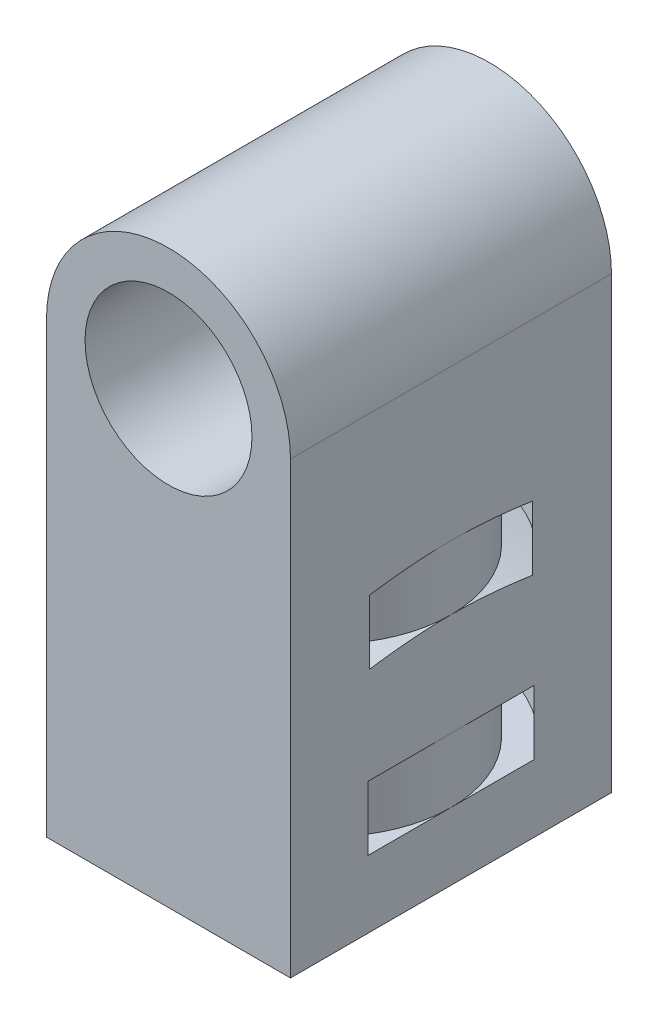
ISO-10303-21;
HEADER;
FILE_DESCRIPTION(('STEP AP214'),'2;1');
FILE_NAME('part.step','',(''),(''),'','','');
FILE_SCHEMA(('AUTOMOTIVE_DESIGN { 1 0 10303 214 1 1 1 1 }'));
ENDSEC;
DATA;
#1=APPLICATION_CONTEXT('core data for automotive mechanical design processes');
#2=APPLICATION_PROTOCOL_DEFINITION('international standard','automotive_design',2000,#1);
#3=PRODUCT_CONTEXT('',#1,'mechanical');
#4=PRODUCT('Part','Part','',(#3));
#5=PRODUCT_RELATED_PRODUCT_CATEGORY('part','',(#4));
#6=PRODUCT_DEFINITION_FORMATION('','',#4);
#7=PRODUCT_DEFINITION_CONTEXT('part definition',#1,'design');
#8=PRODUCT_DEFINITION('design','',#6,#7);
#9=PRODUCT_DEFINITION_SHAPE('','',#8);
#10=(LENGTH_UNIT() NAMED_UNIT(*) SI_UNIT(.MILLI.,.METRE.));
#11=(NAMED_UNIT(*) PLANE_ANGLE_UNIT() SI_UNIT($,.RADIAN.));
#12=(NAMED_UNIT(*) SI_UNIT($,.STERADIAN.) SOLID_ANGLE_UNIT());
#13=UNCERTAINTY_MEASURE_WITH_UNIT(LENGTH_MEASURE(1.E-05),#10,'distance_accuracy_value','');
#14=(GEOMETRIC_REPRESENTATION_CONTEXT(3) GLOBAL_UNCERTAINTY_ASSIGNED_CONTEXT((#13)) GLOBAL_UNIT_ASSIGNED_CONTEXT((#10,
#11,#12)) REPRESENTATION_CONTEXT('',''));
#15=CARTESIAN_POINT('',(0.,0.,0.));
#16=DIRECTION('',(0.,0.,1.));
#17=DIRECTION('',(1.,0.,0.));
#18=AXIS2_PLACEMENT_3D('',#15,#16,#17);
#19=CARTESIAN_POINT('',(9.5,-10.,-12.5));
#20=DIRECTION('',(1.,0.,0.));
#21=DIRECTION('',(0.,1.,0.));
#22=AXIS2_PLACEMENT_3D('',#19,#20,#21);
#23=PLANE('',#22);
#24=DIRECTION('',(0.,0.,-1.));
#25=VECTOR('',#24,1.);
#26=CARTESIAN_POINT('',(9.5,-29.75,-12.5));
#27=LINE('',#26,#25);
#28=CARTESIAN_POINT('',(9.5,-29.75,6.48074069840786));
#29=VERTEX_POINT('',#28);
#30=CARTESIAN_POINT('',(9.5,-29.75,0.));
#31=VERTEX_POINT('',#30);
#32=EDGE_CURVE('E299',#29,#31,#27,.T.);
#33=ORIENTED_EDGE('',*,*,#32,.F.);
#34=DIRECTION('',(0.,1.,0.));
#35=VECTOR('',#34,1.);
#36=CARTESIAN_POINT('',(9.5,-6.5,6.48074069840786));
#37=LINE('',#36,#35);
#38=CARTESIAN_POINT('',(9.5,-24.75,6.48074069840786));
#39=VERTEX_POINT('',#38);
#40=EDGE_CURVE('E339',#39,#29,#37,.F.);
#41=ORIENTED_EDGE('',*,*,#40,.F.);
#42=DIRECTION('',(0.,0.,-1.));
#43=VECTOR('',#42,1.);
#44=CARTESIAN_POINT('',(9.5,-24.75,-12.5));
#45=LINE('',#44,#43);
#46=CARTESIAN_POINT('',(9.5,-24.75,0.));
#47=VERTEX_POINT('',#46);
#48=EDGE_CURVE('E338',#39,#47,#45,.T.);
#49=ORIENTED_EDGE('',*,*,#48,.T.);
#50=CARTESIAN_POINT('',(9.5,-24.75,-6.48074069840786));
#51=VERTEX_POINT('',#50);
#52=EDGE_CURVE('E173',#47,#51,#45,.T.);
#53=ORIENTED_EDGE('',*,*,#52,.T.);
#54=DIRECTION('',(0.,1.,0.));
#55=VECTOR('',#54,1.);
#56=CARTESIAN_POINT('',(9.5,-6.5,-6.48074069840786));
#57=LINE('',#56,#55);
#58=CARTESIAN_POINT('',(9.5,-29.75,-6.48074069840786));
#59=VERTEX_POINT('',#58);
#60=EDGE_CURVE('E341',#59,#51,#57,.T.);
#61=ORIENTED_EDGE('',*,*,#60,.F.);
#62=EDGE_CURVE('E343',#31,#59,#27,.T.);
#63=ORIENTED_EDGE('',*,*,#62,.F.);
#64=EDGE_LOOP('',(#33,#41,#49,#53,#61,#63));
#65=FACE_BOUND('',#64,.T.);
#66=DIRECTION('',(0.,1.,0.));
#67=VECTOR('',#66,1.);
#68=CARTESIAN_POINT('',(9.5,-10.,12.5));
#69=LINE('',#68,#67);
#70=CARTESIAN_POINT('',(9.5,-35.,12.5));
#71=VERTEX_POINT('',#70);
#72=CARTESIAN_POINT('',(9.5,0.,12.5));
#73=VERTEX_POINT('',#72);
#74=EDGE_CURVE('E303',#71,#73,#69,.T.);
#75=ORIENTED_EDGE('',*,*,#74,.F.);
#76=DIRECTION('',(0.,0.,1.));
#77=VECTOR('',#76,1.);
#78=CARTESIAN_POINT('',(9.5,-35.,-12.5));
#79=LINE('',#78,#77);
#80=CARTESIAN_POINT('',(9.5,-35.,-12.5));
#81=VERTEX_POINT('',#80);
#82=EDGE_CURVE('E563',#81,#71,#79,.T.);
#83=ORIENTED_EDGE('',*,*,#82,.F.);
#84=DIRECTION('',(0.,1.,0.));
#85=VECTOR('',#84,1.);
#86=CARTESIAN_POINT('',(9.5,-10.,-12.5));
#87=LINE('',#86,#85);
#88=CARTESIAN_POINT('',(9.5,0.,-12.5));
#89=VERTEX_POINT('',#88);
#90=EDGE_CURVE('E552',#81,#89,#87,.T.);
#91=ORIENTED_EDGE('',*,*,#90,.T.);
#92=DIRECTION('',(0.,0.,1.));
#93=VECTOR('',#92,1.);
#94=CARTESIAN_POINT('',(9.5,0.,-12.5));
#95=LINE('',#94,#93);
#96=EDGE_CURVE('E532',#89,#73,#95,.T.);
#97=ORIENTED_EDGE('',*,*,#96,.T.);
#98=EDGE_LOOP('',(#75,#83,#91,#97));
#99=FACE_BOUND('',#98,.T.);
#100=CARTESIAN_POINT('',(9.5,-18.5940001794606,34.3096150478611));
#101=CARTESIAN_POINT('',(9.5,-18.4104595878438,33.583287858128));
#102=CARTESIAN_POINT('',(9.5,-18.2272942427413,32.8568655741935));
#103=CARTESIAN_POINT('',(9.5,-17.8619040372227,31.4037835481128));
#104=CARTESIAN_POINT('',(9.5,-17.6796791780349,30.6771238056579));
#105=CARTESIAN_POINT('',(9.5,-17.316309413949,29.2233174338884));
#106=CARTESIAN_POINT('',(9.5,-17.1351648266208,28.4961707251553));
#107=CARTESIAN_POINT('',(9.5,-16.7742688751346,27.0415315671237));
#108=CARTESIAN_POINT('',(9.5,-16.5945175107908,26.3140391178712));
#109=CARTESIAN_POINT('',(9.5,-16.2325036702304,24.8413595475527));
#110=CARTESIAN_POINT('',(9.5,-16.0502828229413,24.0961621847589));
#111=CARTESIAN_POINT('',(9.5,-15.6881513560162,22.6052065111694));
#112=CARTESIAN_POINT('',(9.5,-15.5082407340685,21.8594482009359));
#113=CARTESIAN_POINT('',(9.5,-15.1514551431804,20.3674081549243));
#114=CARTESIAN_POINT('',(9.5,-14.9745794026589,19.6211266039413));
#115=CARTESIAN_POINT('',(9.5,-14.6247702626984,18.1276365749566));
#116=CARTESIAN_POINT('',(9.5,-14.4518368707429,17.3804280951981));
#117=CARTESIAN_POINT('',(9.5,-14.1187198970002,15.9174306703127));
#118=CARTESIAN_POINT('',(9.5,-13.9583092568577,15.2016936038036));
#119=CARTESIAN_POINT('',(9.5,-13.6441128718866,13.7687633704708));
#120=CARTESIAN_POINT('',(9.5,-13.4903271161288,13.0515702060512));
#121=CARTESIAN_POINT('',(9.5,-13.1917895153087,11.6145241203518));
#122=CARTESIAN_POINT('',(9.5,-13.0470470186099,10.8946692356507));
#123=CARTESIAN_POINT('',(9.5,-12.839755242133,9.81298195188404));
#124=CARTESIAN_POINT('',(9.5,-12.7722931956616,9.45209172028482));
#125=CARTESIAN_POINT('',(9.5,-12.6413092515822,8.72959877826552));
#126=CARTESIAN_POINT('',(9.5,-12.5777873110619,8.36799607564936));
#127=CARTESIAN_POINT('',(9.5,-12.4562624738004,7.64881234547324));
#128=CARTESIAN_POINT('',(9.5,-12.3981973188229,7.29124192731229));
#129=CARTESIAN_POINT('',(9.5,-12.2875208224032,6.57526148055471));
#130=CARTESIAN_POINT('',(9.5,-12.2349095407431,6.2168514427987));
#131=CARTESIAN_POINT('',(9.5,-12.0867396466977,5.14026211042967));
#132=CARTESIAN_POINT('',(9.5,-12.0008366490465,4.42067580269187));
#133=CARTESIAN_POINT('',(9.5,-11.8979840507362,3.33969834915197));
#134=CARTESIAN_POINT('',(9.5,-11.8680533098223,2.97952705245293));
#135=CARTESIAN_POINT('',(9.5,-11.8178069673897,2.25850381276945));
#136=CARTESIAN_POINT('',(9.5,-11.7974912985723,1.89765187456677));
#137=CARTESIAN_POINT('',(9.5,-11.7672603900713,1.17556904098546));
#138=CARTESIAN_POINT('',(9.5,-11.7573434008062,0.814338219595086));
#139=CARTESIAN_POINT('',(9.5,-11.7483184953059,0.0917406115624856));
#140=CARTESIAN_POINT('',(9.5,-11.7492105291058,-0.269626174443523));
#141=CARTESIAN_POINT('',(9.5,-11.7615452144799,-0.979590021655254));
#142=CARTESIAN_POINT('',(9.5,-11.7726194406145,-1.32819362528374));
#143=CARTESIAN_POINT('',(9.5,-11.8043716631822,-2.02495921088784));
#144=CARTESIAN_POINT('',(9.5,-11.8250496920841,-2.3731211913664));
#145=CARTESIAN_POINT('',(9.5,-11.8752800186238,-3.06885676445908));
#146=CARTESIAN_POINT('',(9.5,-11.9048338111138,-3.41643024803479));
#147=CARTESIAN_POINT('',(9.5,-11.9718973690187,-4.11081466006508));
#148=CARTESIAN_POINT('',(9.5,-12.0094074842543,-4.45762555431275));
#149=CARTESIAN_POINT('',(9.5,-12.1325595533156,-5.49846097059398));
#150=CARTESIAN_POINT('',(9.5,-12.2286955308348,-6.19124608496361));
#151=CARTESIAN_POINT('',(9.5,-12.4413393013675,-7.57355613875835));
#152=CARTESIAN_POINT('',(9.5,-12.557846278919,-8.26308120755049));
#153=CARTESIAN_POINT('',(9.5,-12.8070220094514,-9.64873950406036));
#154=CARTESIAN_POINT('',(9.5,-12.9398867973797,-10.344837116822));
#155=CARTESIAN_POINT('',(9.5,-13.2161792537895,-11.7349056381745));
#156=CARTESIAN_POINT('',(9.5,-13.3596068317596,-12.4288765649356));
#157=CARTESIAN_POINT('',(9.5,-13.6538996084103,-13.814436250205));
#158=CARTESIAN_POINT('',(9.5,-13.8047564832014,-14.5060267859574));
#159=CARTESIAN_POINT('',(9.5,-14.1120291641412,-15.8879648182586));
#160=CARTESIAN_POINT('',(9.5,-14.2684449535411,-16.5783123185461));
#161=CARTESIAN_POINT('',(9.5,-14.5923627636727,-17.9882129158208));
#162=CARTESIAN_POINT('',(9.5,-14.760050488671,-18.7077232451551));
#163=CARTESIAN_POINT('',(9.5,-15.0988377625137,-20.1459384828576));
#164=CARTESIAN_POINT('',(9.5,-15.2699373109351,-20.8646433913256));
#165=CARTESIAN_POINT('',(9.5,-15.6148158829257,-22.3016540726439));
#166=CARTESIAN_POINT('',(9.5,-15.7885957519021,-23.0199596423348));
#167=CARTESIAN_POINT('',(9.5,-16.1382105351397,-24.4560706148763));
#168=CARTESIAN_POINT('',(9.5,-16.3140454510682,-25.1738760173206));
#169=CARTESIAN_POINT('',(9.5,-16.6635670998738,-26.5937178124066));
#170=CARTESIAN_POINT('',(9.5,-16.8372192064394,-27.295762735252));
#171=CARTESIAN_POINT('',(9.5,-17.1857929643631,-28.6995373694732));
#172=CARTESIAN_POINT('',(9.5,-17.3607146160361,-29.4012670807707));
#173=CARTESIAN_POINT('',(9.5,-17.7115372088056,-30.8042243982583));
#174=CARTESIAN_POINT('',(9.5,-17.8874377913662,-31.5054520941489));
#175=CARTESIAN_POINT('',(9.5,-18.2401088008124,-32.9076878120199));
#176=CARTESIAN_POINT('',(9.5,-18.4168792266013,-33.608695834276));
#177=CARTESIAN_POINT('',(9.5,-18.5940001794606,-34.3096150478611));
#178=B_SPLINE_CURVE_WITH_KNOTS('',3,(#100,#101,#102,#103,#104,#105,#106,#107,#108,#109,#110,
#111,#112,#113,#114,#115,#116,#117,#118,#119,#120,#121,#122,#123,#124,#125,#126,#127,#128,#129,
#130,#131,#132,#133,#134,#135,#136,#137,#138,#139,#140,#141,#142,#143,#144,#145,#146,#147,#148,
#149,#150,#151,#152,#153,#154,#155,#156,#157,#158,#159,#160,#161,#162,#163,#164,#165,#166,#167,
#168,#169,#170,#171,#172,#173,#174,#175,#176,#177),.UNSPECIFIED.,.F.,.F.,(4,2,2,2,2,2,2,2,2,2,2,
2,2,2,2,2,2,2,2,2,2,2,2,2,2,2,2,2,2,2,2,2,2,2,2,2,2,2,4),(0.,2.24747554583677,4.4949540263018,
6.74306350480392,8.99117268337091,11.2926284845608,13.5940819827856,15.894941425808,
18.1958052360467,20.3962589262327,22.5967089861222,24.7993973315644,25.9008042763521,
27.0021992234385,28.0889193333589,29.1756513540005,31.3489699082154,32.4331041183486,
33.5172307401912,34.6011749280527,35.6851141053588,36.7313134417835,37.7775163152511,
38.8238954886518,39.8703206784272,41.9681082944804,44.065811954192,46.1916871419316,
48.3175441154162,50.4410711579981,52.564591803064,54.7809581966685,56.9973243155716,
59.2144044120004,61.4314863073811,63.6010929495919,65.7707001301629,67.9395590701614,
70.1084152760672),.UNSPECIFIED.);
#179=CARTESIAN_POINT('',(9.5,-12.2572833711301,6.36396078731212));
#180=VERTEX_POINT('',#179);
#181=CARTESIAN_POINT('',(9.5,-11.75,0.));
#182=VERTEX_POINT('',#181);
#183=EDGE_CURVE('E229',#180,#182,#178,.T.);
#184=ORIENTED_EDGE('',*,*,#183,.T.);
#185=CARTESIAN_POINT('',(9.5,-12.2572833711301,-6.36396078731212));
#186=VERTEX_POINT('',#185);
#187=EDGE_CURVE('E221',#182,#186,#178,.T.);
#188=ORIENTED_EDGE('',*,*,#187,.T.);
#189=DIRECTION('',(0.,1.,0.));
#190=VECTOR('',#189,1.);
#191=CARTESIAN_POINT('',(9.5,-6.5,-6.36396078731212));
#192=LINE('',#191,#190);
#193=CARTESIAN_POINT('',(9.5,-17.2572833711301,-6.36396078731212));
#194=VERTEX_POINT('',#193);
#195=EDGE_CURVE('E230',#186,#194,#192,.F.);
#196=ORIENTED_EDGE('',*,*,#195,.T.);
#197=CARTESIAN_POINT('',(9.5,-23.5940001794606,34.3096150478611));
#198=CARTESIAN_POINT('',(9.5,-23.4104595878438,33.583287858128));
#199=CARTESIAN_POINT('',(9.5,-23.2272942427413,32.8568655741935));
#200=CARTESIAN_POINT('',(9.5,-22.8619040372227,31.4037835481128));
#201=CARTESIAN_POINT('',(9.5,-22.6796791780349,30.6771238056579));
#202=CARTESIAN_POINT('',(9.5,-22.316309413949,29.2233174338884));
#203=CARTESIAN_POINT('',(9.5,-22.1351648266208,28.4961707251553));
#204=CARTESIAN_POINT('',(9.5,-21.7742688751346,27.0415315671237));
#205=CARTESIAN_POINT('',(9.5,-21.5945175107908,26.3140391178712));
#206=CARTESIAN_POINT('',(9.5,-21.2325036702303,24.8413595475526));
#207=CARTESIAN_POINT('',(9.5,-21.0502828229413,24.0961621847589));
#208=CARTESIAN_POINT('',(9.5,-20.6881513560162,22.6052065111694));
#209=CARTESIAN_POINT('',(9.5,-20.5082407340685,21.8594482009358));
#210=CARTESIAN_POINT('',(9.5,-20.1514551431804,20.3674081549243));
#211=CARTESIAN_POINT('',(9.5,-19.9745794026589,19.6211266039413));
#212=CARTESIAN_POINT('',(9.5,-19.6247702626984,18.1276365749566));
#213=CARTESIAN_POINT('',(9.5,-19.4518368707429,17.3804280951981));
#214=CARTESIAN_POINT('',(9.5,-19.1187198970002,15.9174306703127));
#215=CARTESIAN_POINT('',(9.5,-18.9583092568577,15.2016936038036));
#216=CARTESIAN_POINT('',(9.5,-18.6441128718866,13.7687633704708));
#217=CARTESIAN_POINT('',(9.5,-18.4903271161288,13.0515702060512));
#218=CARTESIAN_POINT('',(9.5,-18.1917895153087,11.6145241203518));
#219=CARTESIAN_POINT('',(9.5,-18.04704701861,10.8946692356508));
#220=CARTESIAN_POINT('',(9.5,-17.839755242133,9.81298195188405));
#221=CARTESIAN_POINT('',(9.5,-17.7722931956616,9.45209172028482));
#222=CARTESIAN_POINT('',(9.5,-17.6413092515822,8.72959877826553));
#223=CARTESIAN_POINT('',(9.5,-17.5777873110619,8.36799607564936));
#224=CARTESIAN_POINT('',(9.5,-17.4562624738004,7.64881234547325));
#225=CARTESIAN_POINT('',(9.5,-17.3981973188229,7.29124192731229));
#226=CARTESIAN_POINT('',(9.5,-17.2875208224032,6.57526148055472));
#227=CARTESIAN_POINT('',(9.5,-17.2349095407431,6.21685144279871));
#228=CARTESIAN_POINT('',(9.5,-17.0867396466977,5.14026211042967));
#229=CARTESIAN_POINT('',(9.5,-17.0008366490465,4.42067580269187));
#230=CARTESIAN_POINT('',(9.5,-16.8979840507362,3.33969834915197));
#231=CARTESIAN_POINT('',(9.5,-16.8680533098223,2.97952705245293));
#232=CARTESIAN_POINT('',(9.5,-16.8178069673897,2.25850381276945));
#233=CARTESIAN_POINT('',(9.5,-16.7974912985723,1.89765187456678));
#234=CARTESIAN_POINT('',(9.5,-16.7672603900713,1.17556904098547));
#235=CARTESIAN_POINT('',(9.5,-16.7573434008062,0.814338219595099));
#236=CARTESIAN_POINT('',(9.5,-16.7483184953059,0.0917406115624991));
#237=CARTESIAN_POINT('',(9.5,-16.7492105291058,-0.269626174443511));
#238=CARTESIAN_POINT('',(9.5,-16.7615452144799,-0.979590021655243));
#239=CARTESIAN_POINT('',(9.5,-16.7726194406145,-1.32819362528373));
#240=CARTESIAN_POINT('',(9.5,-16.8043716631822,-2.02495921088782));
#241=CARTESIAN_POINT('',(9.5,-16.8250496920841,-2.37312119136639));
#242=CARTESIAN_POINT('',(9.5,-16.8752800186238,-3.06885676445907));
#243=CARTESIAN_POINT('',(9.5,-16.9048338111138,-3.41643024803478));
#244=CARTESIAN_POINT('',(9.5,-16.9718973690187,-4.11081466006507));
#245=CARTESIAN_POINT('',(9.5,-17.0094074842543,-4.45762555431274));
#246=CARTESIAN_POINT('',(9.5,-17.1325595533156,-5.49846097059397));
#247=CARTESIAN_POINT('',(9.5,-17.2286955308348,-6.1912460849636));
#248=CARTESIAN_POINT('',(9.5,-17.4413393013675,-7.57355613875833));
#249=CARTESIAN_POINT('',(9.5,-17.557846278919,-8.26308120755048));
#250=CARTESIAN_POINT('',(9.5,-17.8070220094514,-9.64873950406035));
#251=CARTESIAN_POINT('',(9.5,-17.9398867973797,-10.344837116822));
#252=CARTESIAN_POINT('',(9.5,-18.2161792537895,-11.7349056381745));
#253=CARTESIAN_POINT('',(9.5,-18.3596068317596,-12.4288765649356));
#254=CARTESIAN_POINT('',(9.5,-18.6538996084103,-13.814436250205));
#255=CARTESIAN_POINT('',(9.5,-18.8047564832014,-14.5060267859573));
#256=CARTESIAN_POINT('',(9.5,-19.1120291641412,-15.8879648182586));
#257=CARTESIAN_POINT('',(9.5,-19.2684449535411,-16.5783123185461));
#258=CARTESIAN_POINT('',(9.5,-19.5923627636726,-17.9882129158208));
#259=CARTESIAN_POINT('',(9.5,-19.760050488671,-18.7077232451551));
#260=CARTESIAN_POINT('',(9.5,-20.0988377625137,-20.1459384828576));
#261=CARTESIAN_POINT('',(9.5,-20.2699373109351,-20.8646433913256));
#262=CARTESIAN_POINT('',(9.5,-20.6148158829257,-22.3016540726439));
#263=CARTESIAN_POINT('',(9.5,-20.7885957519021,-23.0199596423348));
#264=CARTESIAN_POINT('',(9.5,-21.1382105351397,-24.4560706148762));
#265=CARTESIAN_POINT('',(9.5,-21.3140454510682,-25.1738760173206));
#266=CARTESIAN_POINT('',(9.5,-21.6635670998738,-26.5937178124066));
#267=CARTESIAN_POINT('',(9.5,-21.8372192064394,-27.295762735252));
#268=CARTESIAN_POINT('',(9.5,-22.1857929643631,-28.6995373694732));
#269=CARTESIAN_POINT('',(9.5,-22.3607146160361,-29.4012670807707));
#270=CARTESIAN_POINT('',(9.5,-22.7115372088056,-30.8042243982583));
#271=CARTESIAN_POINT('',(9.5,-22.8874377913662,-31.5054520941489));
#272=CARTESIAN_POINT('',(9.5,-23.2401088008124,-32.9076878120198));
#273=CARTESIAN_POINT('',(9.5,-23.4168792266013,-33.608695834276));
#274=CARTESIAN_POINT('',(9.5,-23.5940001794606,-34.3096150478611));
#275=B_SPLINE_CURVE_WITH_KNOTS('',3,(#197,#198,#199,#200,#201,#202,#203,#204,#205,#206,#207,
#208,#209,#210,#211,#212,#213,#214,#215,#216,#217,#218,#219,#220,#221,#222,#223,#224,#225,#226,
#227,#228,#229,#230,#231,#232,#233,#234,#235,#236,#237,#238,#239,#240,#241,#242,#243,#244,#245,
#246,#247,#248,#249,#250,#251,#252,#253,#254,#255,#256,#257,#258,#259,#260,#261,#262,#263,#264,
#265,#266,#267,#268,#269,#270,#271,#272,#273,#274),.UNSPECIFIED.,.F.,.F.,(4,2,2,2,2,2,2,2,2,2,2,
2,2,2,2,2,2,2,2,2,2,2,2,2,2,2,2,2,2,2,2,2,2,2,2,2,2,2,4),(0.,2.24747554583678,4.4949540263018,
6.74306350480391,8.99117268337091,11.2926284845608,13.5940819827856,15.894941425808,
18.1958052360467,20.3962589262327,22.5967089861222,24.7993973315644,25.900804276352,
27.0021992234385,28.0889193333589,29.1756513540005,31.3489699082154,32.4331041183485,
33.5172307401911,34.6011749280527,35.6851141053587,36.7313134417835,37.7775163152511,
38.8238954886518,39.8703206784272,41.9681082944804,44.065811954192,46.1916871419316,
48.3175441154162,50.4410711579981,52.564591803064,54.7809581966685,56.9973243155716,
59.2144044120004,61.4314863073811,63.6010929495919,65.7707001301629,67.9395590701614,
70.1084152760672),.UNSPECIFIED.);
#276=CARTESIAN_POINT('',(9.5,-16.75,0.));
#277=VERTEX_POINT('',#276);
#278=EDGE_CURVE('E232',#277,#194,#275,.T.);
#279=ORIENTED_EDGE('',*,*,#278,.F.);
#280=CARTESIAN_POINT('',(9.5,-17.2572833711301,6.36396078731212));
#281=VERTEX_POINT('',#280);
#282=EDGE_CURVE('E238',#281,#277,#275,.T.);
#283=ORIENTED_EDGE('',*,*,#282,.F.);
#284=DIRECTION('',(0.,1.,0.));
#285=VECTOR('',#284,1.);
#286=CARTESIAN_POINT('',(9.5,-6.5,6.36396078731212));
#287=LINE('',#286,#285);
#288=EDGE_CURVE('E309',#281,#180,#287,.T.);
#289=ORIENTED_EDGE('',*,*,#288,.T.);
#290=EDGE_LOOP('',(#184,#188,#196,#279,#283,#289));
#291=FACE_BOUND('',#290,.T.);
#292=ADVANCED_FACE('F39',(#65,#99,#291),#23,.T.);
#293=CARTESIAN_POINT('',(-9.5,-10.,-12.5));
#294=DIRECTION('',(-1.,0.,0.));
#295=DIRECTION('',(0.,-1.,0.));
#296=AXIS2_PLACEMENT_3D('',#293,#294,#295);
#297=PLANE('',#296);
#298=DIRECTION('',(0.,0.,1.));
#299=VECTOR('',#298,1.);
#300=CARTESIAN_POINT('',(-9.5,-29.75,-12.5));
#301=LINE('',#300,#299);
#302=CARTESIAN_POINT('',(-9.5,-29.75,-6.48074069840785));
#303=VERTEX_POINT('',#302);
#304=CARTESIAN_POINT('',(-9.5,-29.75,0.));
#305=VERTEX_POINT('',#304);
#306=EDGE_CURVE('E191',#303,#305,#301,.T.);
#307=ORIENTED_EDGE('',*,*,#306,.F.);
#308=DIRECTION('',(0.,1.,0.));
#309=VECTOR('',#308,1.);
#310=CARTESIAN_POINT('',(-9.5,-6.5,-6.48074069840785));
#311=LINE('',#310,#309);
#312=CARTESIAN_POINT('',(-9.5,-24.75,-6.48074069840785));
#313=VERTEX_POINT('',#312);
#314=EDGE_CURVE('E182',#313,#303,#311,.F.);
#315=ORIENTED_EDGE('',*,*,#314,.F.);
#316=DIRECTION('',(0.,0.,1.));
#317=VECTOR('',#316,1.);
#318=CARTESIAN_POINT('',(-9.5,-24.75,-12.5));
#319=LINE('',#318,#317);
#320=CARTESIAN_POINT('',(-9.5,-24.75,0.));
#321=VERTEX_POINT('',#320);
#322=EDGE_CURVE('E166',#313,#321,#319,.T.);
#323=ORIENTED_EDGE('',*,*,#322,.T.);
#324=CARTESIAN_POINT('',(-9.5,-24.75,6.48074069840785));
#325=VERTEX_POINT('',#324);
#326=EDGE_CURVE('E154',#321,#325,#319,.T.);
#327=ORIENTED_EDGE('',*,*,#326,.T.);
#328=DIRECTION('',(0.,1.,0.));
#329=VECTOR('',#328,1.);
#330=CARTESIAN_POINT('',(-9.5,-6.5,6.48074069840785));
#331=LINE('',#330,#329);
#332=CARTESIAN_POINT('',(-9.5,-29.75,6.48074069840785));
#333=VERTEX_POINT('',#332);
#334=EDGE_CURVE('E183',#333,#325,#331,.T.);
#335=ORIENTED_EDGE('',*,*,#334,.F.);
#336=EDGE_CURVE('E189',#305,#333,#301,.T.);
#337=ORIENTED_EDGE('',*,*,#336,.F.);
#338=EDGE_LOOP('',(#307,#315,#323,#327,#335,#337));
#339=FACE_BOUND('',#338,.T.);
#340=DIRECTION('',(0.,-1.,0.));
#341=VECTOR('',#340,1.);
#342=CARTESIAN_POINT('',(-9.5,-10.,12.5));
#343=LINE('',#342,#341);
#344=CARTESIAN_POINT('',(-9.5,0.,12.5));
#345=VERTEX_POINT('',#344);
#346=CARTESIAN_POINT('',(-9.5,-35.,12.5));
#347=VERTEX_POINT('',#346);
#348=EDGE_CURVE('E537',#345,#347,#343,.T.);
#349=ORIENTED_EDGE('',*,*,#348,.F.);
#350=DIRECTION('',(0.,0.,1.));
#351=VECTOR('',#350,1.);
#352=CARTESIAN_POINT('',(-9.5,0.,-12.5));
#353=LINE('',#352,#351);
#354=CARTESIAN_POINT('',(-9.5,0.,-12.5));
#355=VERTEX_POINT('',#354);
#356=EDGE_CURVE('E534',#355,#345,#353,.T.);
#357=ORIENTED_EDGE('',*,*,#356,.F.);
#358=DIRECTION('',(0.,-1.,0.));
#359=VECTOR('',#358,1.);
#360=CARTESIAN_POINT('',(-9.5,-10.,-12.5));
#361=LINE('',#360,#359);
#362=CARTESIAN_POINT('',(-9.5,-35.,-12.5));
#363=VERTEX_POINT('',#362);
#364=EDGE_CURVE('E548',#355,#363,#361,.T.);
#365=ORIENTED_EDGE('',*,*,#364,.T.);
#366=DIRECTION('',(0.,0.,-1.));
#367=VECTOR('',#366,1.);
#368=CARTESIAN_POINT('',(-9.5,-35.,-12.5));
#369=LINE('',#368,#367);
#370=EDGE_CURVE('E567',#347,#363,#369,.T.);
#371=ORIENTED_EDGE('',*,*,#370,.F.);
#372=EDGE_LOOP('',(#349,#357,#365,#371));
#373=FACE_BOUND('',#372,.T.);
#374=CARTESIAN_POINT('',(-9.5,-18.5940001794606,-34.3096150478611));
#375=CARTESIAN_POINT('',(-9.5,-18.4104595878438,-33.583287858128));
#376=CARTESIAN_POINT('',(-9.5,-18.2272942427413,-32.8568655741935));
#377=CARTESIAN_POINT('',(-9.5,-17.8619040372227,-31.4037835481128));
#378=CARTESIAN_POINT('',(-9.5,-17.6796791780349,-30.6771238056579));
#379=CARTESIAN_POINT('',(-9.5,-17.316309413949,-29.2233174338884));
#380=CARTESIAN_POINT('',(-9.5,-17.1351648266208,-28.4961707251553));
#381=CARTESIAN_POINT('',(-9.5,-16.7742688751346,-27.0415315671237));
#382=CARTESIAN_POINT('',(-9.5,-16.5945175107908,-26.3140391178712));
#383=CARTESIAN_POINT('',(-9.5,-16.2325036702303,-24.8413595475526));
#384=CARTESIAN_POINT('',(-9.5,-16.0502828229413,-24.0961621847589));
#385=CARTESIAN_POINT('',(-9.5,-15.6881513560162,-22.6052065111694));
#386=CARTESIAN_POINT('',(-9.5,-15.5082407340685,-21.8594482009359));
#387=CARTESIAN_POINT('',(-9.5,-15.1514551431804,-20.3674081549243));
#388=CARTESIAN_POINT('',(-9.5,-14.9745794026589,-19.6211266039413));
#389=CARTESIAN_POINT('',(-9.5,-14.6247702626984,-18.1276365749566));
#390=CARTESIAN_POINT('',(-9.5,-14.4518368707429,-17.3804280951981));
#391=CARTESIAN_POINT('',(-9.5,-14.1187198970002,-15.9174306703127));
#392=CARTESIAN_POINT('',(-9.5,-13.9583092568577,-15.2016936038036));
#393=CARTESIAN_POINT('',(-9.5,-13.6441128718866,-13.7687633704708));
#394=CARTESIAN_POINT('',(-9.5,-13.4903271161288,-13.0515702060512));
#395=CARTESIAN_POINT('',(-9.5,-13.1917895153087,-11.6145241203518));
#396=CARTESIAN_POINT('',(-9.5,-13.04704701861,-10.8946692356507));
#397=CARTESIAN_POINT('',(-9.5,-12.839755242133,-9.81298195188404));
#398=CARTESIAN_POINT('',(-9.5,-12.7722931956616,-9.45209172028482));
#399=CARTESIAN_POINT('',(-9.5,-12.6413092515822,-8.72959877826552));
#400=CARTESIAN_POINT('',(-9.5,-12.5777873110619,-8.36799607564936));
#401=CARTESIAN_POINT('',(-9.5,-12.4562624738004,-7.64881234547324));
#402=CARTESIAN_POINT('',(-9.5,-12.3981973188229,-7.29124192731229));
#403=CARTESIAN_POINT('',(-9.5,-12.2875208224032,-6.57526148055471));
#404=CARTESIAN_POINT('',(-9.5,-12.2349095407431,-6.2168514427987));
#405=CARTESIAN_POINT('',(-9.5,-12.0867396466977,-5.14026211042967));
#406=CARTESIAN_POINT('',(-9.5,-12.0008366490465,-4.42067580269187));
#407=CARTESIAN_POINT('',(-9.5,-11.8979840507362,-3.33969834915197));
#408=CARTESIAN_POINT('',(-9.5,-11.8680533098223,-2.97952705245293));
#409=CARTESIAN_POINT('',(-9.5,-11.8178069673897,-2.25850381276945));
#410=CARTESIAN_POINT('',(-9.5,-11.7974912985723,-1.89765187456677));
#411=CARTESIAN_POINT('',(-9.5,-11.7672603900713,-1.17556904098546));
#412=CARTESIAN_POINT('',(-9.5,-11.7573434008062,-0.814338219595086));
#413=CARTESIAN_POINT('',(-9.5,-11.7483184953059,-0.0917406115624862));
#414=CARTESIAN_POINT('',(-9.5,-11.7492105291058,0.269626174443522));
#415=CARTESIAN_POINT('',(-9.5,-11.7615452144799,0.979590021655253));
#416=CARTESIAN_POINT('',(-9.5,-11.7726194406145,1.32819362528374));
#417=CARTESIAN_POINT('',(-9.5,-11.8043716631822,2.02495921088783));
#418=CARTESIAN_POINT('',(-9.5,-11.8250496920841,2.3731211913664));
#419=CARTESIAN_POINT('',(-9.5,-11.8752800186238,3.06885676445908));
#420=CARTESIAN_POINT('',(-9.5,-11.9048338111138,3.41643024803479));
#421=CARTESIAN_POINT('',(-9.5,-11.9718973690187,4.11081466006508));
#422=CARTESIAN_POINT('',(-9.5,-12.0094074842543,4.45762555431275));
#423=CARTESIAN_POINT('',(-9.5,-12.1325595533157,5.49846097059398));
#424=CARTESIAN_POINT('',(-9.5,-12.2286955308348,6.19124608496361));
#425=CARTESIAN_POINT('',(-9.5,-12.4413393013675,7.57355613875835));
#426=CARTESIAN_POINT('',(-9.5,-12.557846278919,8.26308120755049));
#427=CARTESIAN_POINT('',(-9.5,-12.8070220094514,9.64873950406036));
#428=CARTESIAN_POINT('',(-9.5,-12.9398867973797,10.344837116822));
#429=CARTESIAN_POINT('',(-9.5,-13.2161792537895,11.7349056381745));
#430=CARTESIAN_POINT('',(-9.5,-13.3596068317596,12.4288765649356));
#431=CARTESIAN_POINT('',(-9.5,-13.6538996084103,13.814436250205));
#432=CARTESIAN_POINT('',(-9.5,-13.8047564832014,14.5060267859574));
#433=CARTESIAN_POINT('',(-9.5,-14.1120291641412,15.8879648182586));
#434=CARTESIAN_POINT('',(-9.5,-14.2684449535411,16.5783123185461));
#435=CARTESIAN_POINT('',(-9.5,-14.5923627636727,17.9882129158208));
#436=CARTESIAN_POINT('',(-9.5,-14.760050488671,18.7077232451551));
#437=CARTESIAN_POINT('',(-9.5,-15.0988377625137,20.1459384828576));
#438=CARTESIAN_POINT('',(-9.5,-15.2699373109351,20.8646433913256));
#439=CARTESIAN_POINT('',(-9.5,-15.6148158829257,22.3016540726439));
#440=CARTESIAN_POINT('',(-9.5,-15.7885957519021,23.0199596423348));
#441=CARTESIAN_POINT('',(-9.5,-16.1382105351397,24.4560706148763));
#442=CARTESIAN_POINT('',(-9.5,-16.3140454510682,25.1738760173206));
#443=CARTESIAN_POINT('',(-9.5,-16.6635670998738,26.5937178124066));
#444=CARTESIAN_POINT('',(-9.5,-16.8372192064394,27.295762735252));
#445=CARTESIAN_POINT('',(-9.5,-17.1857929643631,28.6995373694732));
#446=CARTESIAN_POINT('',(-9.5,-17.3607146160361,29.4012670807707));
#447=CARTESIAN_POINT('',(-9.5,-17.7115372088056,30.8042243982583));
#448=CARTESIAN_POINT('',(-9.5,-17.8874377913662,31.5054520941489));
#449=CARTESIAN_POINT('',(-9.5,-18.2401088008124,32.9076878120199));
#450=CARTESIAN_POINT('',(-9.5,-18.4168792266013,33.608695834276));
#451=CARTESIAN_POINT('',(-9.5,-18.5940001794606,34.3096150478611));
#452=B_SPLINE_CURVE_WITH_KNOTS('',3,(#374,#375,#376,#377,#378,#379,#380,#381,#382,#383,#384,
#385,#386,#387,#388,#389,#390,#391,#392,#393,#394,#395,#396,#397,#398,#399,#400,#401,#402,#403,
#404,#405,#406,#407,#408,#409,#410,#411,#412,#413,#414,#415,#416,#417,#418,#419,#420,#421,#422,
#423,#424,#425,#426,#427,#428,#429,#430,#431,#432,#433,#434,#435,#436,#437,#438,#439,#440,#441,
#442,#443,#444,#445,#446,#447,#448,#449,#450,#451),.UNSPECIFIED.,.F.,.F.,(4,2,2,2,2,2,2,2,2,2,2,
2,2,2,2,2,2,2,2,2,2,2,2,2,2,2,2,2,2,2,2,2,2,2,2,2,2,2,4),(0.,2.24747554583677,4.49495402630181,
6.74306350480393,8.99117268337092,11.2926284845608,13.5940819827856,15.894941425808,
18.1958052360467,20.3962589262327,22.5967089861222,24.7993973315644,25.9008042763521,
27.0021992234385,28.0889193333589,29.1756513540005,31.3489699082154,32.4331041183486,
33.5172307401912,34.6011749280527,35.6851141053588,36.7313134417835,37.7775163152511,
38.8238954886518,39.8703206784272,41.9681082944804,44.065811954192,46.1916871419316,
48.3175441154162,50.4410711579981,52.564591803064,54.7809581966685,56.9973243155716,
59.2144044120004,61.4314863073811,63.6010929495919,65.7707001301629,67.9395590701614,
70.1084152760672),.UNSPECIFIED.);
#453=CARTESIAN_POINT('',(-9.5,-12.2572833711301,-6.36396078731211));
#454=VERTEX_POINT('',#453);
#455=CARTESIAN_POINT('',(-9.5,-11.75,0.));
#456=VERTEX_POINT('',#455);
#457=EDGE_CURVE('E49',#454,#456,#452,.T.);
#458=ORIENTED_EDGE('',*,*,#457,.T.);
#459=CARTESIAN_POINT('',(-9.5,-12.2572833711301,6.36396078731211));
#460=VERTEX_POINT('',#459);
#461=EDGE_CURVE('E11',#456,#460,#452,.T.);
#462=ORIENTED_EDGE('',*,*,#461,.T.);
#463=DIRECTION('',(0.,1.,0.));
#464=VECTOR('',#463,1.);
#465=CARTESIAN_POINT('',(-9.5,-6.5,6.36396078731211));
#466=LINE('',#465,#464);
#467=CARTESIAN_POINT('',(-9.5,-17.2572833711301,6.36396078731211));
#468=VERTEX_POINT('',#467);
#469=EDGE_CURVE('E43',#460,#468,#466,.F.);
#470=ORIENTED_EDGE('',*,*,#469,.T.);
#471=CARTESIAN_POINT('',(-9.5,-23.5940001794606,-34.3096150478611));
#472=CARTESIAN_POINT('',(-9.5,-23.4104595878438,-33.583287858128));
#473=CARTESIAN_POINT('',(-9.5,-23.2272942427413,-32.8568655741935));
#474=CARTESIAN_POINT('',(-9.5,-22.8619040372227,-31.4037835481128));
#475=CARTESIAN_POINT('',(-9.5,-22.6796791780349,-30.6771238056579));
#476=CARTESIAN_POINT('',(-9.5,-22.316309413949,-29.2233174338884));
#477=CARTESIAN_POINT('',(-9.5,-22.1351648266208,-28.4961707251553));
#478=CARTESIAN_POINT('',(-9.5,-21.7742688751346,-27.0415315671237));
#479=CARTESIAN_POINT('',(-9.5,-21.5945175107908,-26.3140391178712));
#480=CARTESIAN_POINT('',(-9.5,-21.2325036702303,-24.8413595475526));
#481=CARTESIAN_POINT('',(-9.5,-21.0502828229413,-24.0961621847589));
#482=CARTESIAN_POINT('',(-9.5,-20.6881513560162,-22.6052065111694));
#483=CARTESIAN_POINT('',(-9.5,-20.5082407340685,-21.8594482009358));
#484=CARTESIAN_POINT('',(-9.5,-20.1514551431804,-20.3674081549243));
#485=CARTESIAN_POINT('',(-9.5,-19.9745794026589,-19.6211266039413));
#486=CARTESIAN_POINT('',(-9.5,-19.6247702626984,-18.1276365749566));
#487=CARTESIAN_POINT('',(-9.5,-19.4518368707429,-17.3804280951981));
#488=CARTESIAN_POINT('',(-9.5,-19.1187198970002,-15.9174306703127));
#489=CARTESIAN_POINT('',(-9.5,-18.9583092568577,-15.2016936038036));
#490=CARTESIAN_POINT('',(-9.5,-18.6441128718866,-13.7687633704708));
#491=CARTESIAN_POINT('',(-9.5,-18.4903271161288,-13.0515702060512));
#492=CARTESIAN_POINT('',(-9.5,-18.1917895153087,-11.6145241203518));
#493=CARTESIAN_POINT('',(-9.5,-18.0470470186099,-10.8946692356508));
#494=CARTESIAN_POINT('',(-9.5,-17.839755242133,-9.81298195188404));
#495=CARTESIAN_POINT('',(-9.5,-17.7722931956616,-9.45209172028482));
#496=CARTESIAN_POINT('',(-9.5,-17.6413092515822,-8.72959877826553));
#497=CARTESIAN_POINT('',(-9.5,-17.5777873110619,-8.36799607564936));
#498=CARTESIAN_POINT('',(-9.5,-17.4562624738004,-7.64881234547325));
#499=CARTESIAN_POINT('',(-9.5,-17.3981973188229,-7.29124192731229));
#500=CARTESIAN_POINT('',(-9.5,-17.2875208224032,-6.57526148055471));
#501=CARTESIAN_POINT('',(-9.5,-17.2349095407431,-6.2168514427987));
#502=CARTESIAN_POINT('',(-9.5,-17.0867396466977,-5.14026211042967));
#503=CARTESIAN_POINT('',(-9.5,-17.0008366490465,-4.42067580269187));
#504=CARTESIAN_POINT('',(-9.5,-16.8979840507362,-3.33969834915197));
#505=CARTESIAN_POINT('',(-9.5,-16.8680533098223,-2.97952705245293));
#506=CARTESIAN_POINT('',(-9.5,-16.8178069673897,-2.25850381276945));
#507=CARTESIAN_POINT('',(-9.5,-16.7974912985723,-1.89765187456677));
#508=CARTESIAN_POINT('',(-9.5,-16.7672603900713,-1.17556904098546));
#509=CARTESIAN_POINT('',(-9.5,-16.7573434008062,-0.814338219595092));
#510=CARTESIAN_POINT('',(-9.5,-16.7483184953059,-0.0917406115624933));
#511=CARTESIAN_POINT('',(-9.5,-16.7492105291058,0.269626174443515));
#512=CARTESIAN_POINT('',(-9.5,-16.7615452144799,0.979590021655245));
#513=CARTESIAN_POINT('',(-9.5,-16.7726194406145,1.32819362528373));
#514=CARTESIAN_POINT('',(-9.5,-16.8043716631822,2.02495921088782));
#515=CARTESIAN_POINT('',(-9.5,-16.8250496920841,2.37312119136639));
#516=CARTESIAN_POINT('',(-9.5,-16.8752800186238,3.06885676445907));
#517=CARTESIAN_POINT('',(-9.5,-16.9048338111138,3.41643024803478));
#518=CARTESIAN_POINT('',(-9.5,-16.9718973690187,4.11081466006507));
#519=CARTESIAN_POINT('',(-9.5,-17.0094074842543,4.45762555431274));
#520=CARTESIAN_POINT('',(-9.5,-17.1325595533157,5.49846097059396));
#521=CARTESIAN_POINT('',(-9.5,-17.2286955308348,6.19124608496359));
#522=CARTESIAN_POINT('',(-9.5,-17.4413393013675,7.57355613875833));
#523=CARTESIAN_POINT('',(-9.5,-17.557846278919,8.26308120755048));
#524=CARTESIAN_POINT('',(-9.5,-17.8070220094514,9.64873950406035));
#525=CARTESIAN_POINT('',(-9.5,-17.9398867973797,10.344837116822));
#526=CARTESIAN_POINT('',(-9.5,-18.2161792537895,11.7349056381745));
#527=CARTESIAN_POINT('',(-9.5,-18.3596068317596,12.4288765649356));
#528=CARTESIAN_POINT('',(-9.5,-18.6538996084103,13.814436250205));
#529=CARTESIAN_POINT('',(-9.5,-18.8047564832014,14.5060267859573));
#530=CARTESIAN_POINT('',(-9.5,-19.1120291641412,15.8879648182586));
#531=CARTESIAN_POINT('',(-9.5,-19.2684449535411,16.5783123185461));
#532=CARTESIAN_POINT('',(-9.5,-19.5923627636726,17.9882129158208));
#533=CARTESIAN_POINT('',(-9.5,-19.760050488671,18.7077232451551));
#534=CARTESIAN_POINT('',(-9.5,-20.0988377625137,20.1459384828576));
#535=CARTESIAN_POINT('',(-9.5,-20.2699373109351,20.8646433913256));
#536=CARTESIAN_POINT('',(-9.5,-20.6148158829257,22.3016540726439));
#537=CARTESIAN_POINT('',(-9.5,-20.7885957519021,23.0199596423348));
#538=CARTESIAN_POINT('',(-9.5,-21.1382105351397,24.4560706148762));
#539=CARTESIAN_POINT('',(-9.5,-21.3140454510682,25.1738760173206));
#540=CARTESIAN_POINT('',(-9.5,-21.6635670998738,26.5937178124066));
#541=CARTESIAN_POINT('',(-9.5,-21.8372192064394,27.295762735252));
#542=CARTESIAN_POINT('',(-9.5,-22.1857929643631,28.6995373694732));
#543=CARTESIAN_POINT('',(-9.5,-22.3607146160361,29.4012670807707));
#544=CARTESIAN_POINT('',(-9.5,-22.7115372088056,30.8042243982583));
#545=CARTESIAN_POINT('',(-9.5,-22.8874377913662,31.5054520941489));
#546=CARTESIAN_POINT('',(-9.5,-23.2401088008124,32.9076878120199));
#547=CARTESIAN_POINT('',(-9.5,-23.4168792266013,33.608695834276));
#548=CARTESIAN_POINT('',(-9.5,-23.5940001794606,34.3096150478611));
#549=B_SPLINE_CURVE_WITH_KNOTS('',3,(#471,#472,#473,#474,#475,#476,#477,#478,#479,#480,#481,
#482,#483,#484,#485,#486,#487,#488,#489,#490,#491,#492,#493,#494,#495,#496,#497,#498,#499,#500,
#501,#502,#503,#504,#505,#506,#507,#508,#509,#510,#511,#512,#513,#514,#515,#516,#517,#518,#519,
#520,#521,#522,#523,#524,#525,#526,#527,#528,#529,#530,#531,#532,#533,#534,#535,#536,#537,#538,
#539,#540,#541,#542,#543,#544,#545,#546,#547,#548),.UNSPECIFIED.,.F.,.F.,(4,2,2,2,2,2,2,2,2,2,2,
2,2,2,2,2,2,2,2,2,2,2,2,2,2,2,2,2,2,2,2,2,2,2,2,2,2,2,4),(0.,2.24747554583678,4.4949540263018,
6.74306350480391,8.99117268337091,11.2926284845608,13.5940819827856,15.894941425808,
18.1958052360467,20.3962589262327,22.5967089861222,24.7993973315644,25.900804276352,
27.0021992234385,28.0889193333589,29.1756513540005,31.3489699082154,32.4331041183485,
33.5172307401912,34.6011749280527,35.6851141053587,36.7313134417835,37.7775163152511,
38.8238954886518,39.8703206784272,41.9681082944804,44.065811954192,46.1916871419316,
48.3175441154162,50.4410711579981,52.564591803064,54.7809581966685,56.9973243155716,
59.2144044120004,61.4314863073811,63.6010929495918,65.7707001301629,67.9395590701614,
70.1084152760672),.UNSPECIFIED.);
#550=CARTESIAN_POINT('',(-9.5,-16.75,0.));
#551=VERTEX_POINT('',#550);
#552=EDGE_CURVE('E201',#551,#468,#549,.T.);
#553=ORIENTED_EDGE('',*,*,#552,.F.);
#554=CARTESIAN_POINT('',(-9.5,-17.2572833711301,-6.36396078731211));
#555=VERTEX_POINT('',#554);
#556=EDGE_CURVE('E581',#555,#551,#549,.T.);
#557=ORIENTED_EDGE('',*,*,#556,.F.);
#558=DIRECTION('',(0.,1.,0.));
#559=VECTOR('',#558,1.);
#560=CARTESIAN_POINT('',(-9.5,-6.5,-6.36396078731211));
#561=LINE('',#560,#559);
#562=EDGE_CURVE('E192',#555,#454,#561,.T.);
#563=ORIENTED_EDGE('',*,*,#562,.T.);
#564=EDGE_LOOP('',(#458,#462,#470,#553,#557,#563));
#565=FACE_BOUND('',#564,.T.);
#566=ADVANCED_FACE('F180',(#339,#373,#565),#297,.T.);
#567=CARTESIAN_POINT('',(0.,0.,-12.5));
#568=DIRECTION('',(0.,0.,1.));
#569=DIRECTION('',(1.,0.,0.));
#570=AXIS2_PLACEMENT_3D('',#567,#568,#569);
#571=CYLINDRICAL_SURFACE('',#570,9.5);
#572=CARTESIAN_POINT('',(0.,0.,12.5));
#573=DIRECTION('',(0.,0.,1.));
#574=DIRECTION('',(1.,0.,0.));
#575=AXIS2_PLACEMENT_3D('',#572,#573,#574);
#576=CIRCLE('',#575,9.5);
#577=EDGE_CURVE('E530',#73,#345,#576,.T.);
#578=ORIENTED_EDGE('',*,*,#577,.F.);
#579=ORIENTED_EDGE('',*,*,#96,.F.);
#580=CARTESIAN_POINT('',(0.,0.,-12.5));
#581=DIRECTION('',(0.,0.,1.));
#582=DIRECTION('',(1.,0.,0.));
#583=AXIS2_PLACEMENT_3D('',#580,#581,#582);
#584=CIRCLE('',#583,9.5);
#585=EDGE_CURVE('E554',#89,#355,#584,.T.);
#586=ORIENTED_EDGE('',*,*,#585,.T.);
#587=ORIENTED_EDGE('',*,*,#356,.T.);
#588=EDGE_LOOP('',(#578,#579,#586,#587));
#589=FACE_BOUND('',#588,.T.);
#590=ADVANCED_FACE('F279',(#589),#571,.T.);
#591=CARTESIAN_POINT('',(0.,0.,-12.5));
#592=DIRECTION('',(0.,0.,1.));
#593=DIRECTION('',(1.,0.,0.));
#594=AXIS2_PLACEMENT_3D('',#591,#592,#593);
#595=PLANE('',#594);
#596=CARTESIAN_POINT('',(0.,0.,-12.5));
#597=DIRECTION('',(0.,0.,1.));
#598=DIRECTION('',(1.,0.,0.));
#599=AXIS2_PLACEMENT_3D('',#596,#597,#598);
#600=CIRCLE('',#599,6.5);
#601=CARTESIAN_POINT('',(6.5,0.,-12.5));
#602=VERTEX_POINT('',#601);
#603=EDGE_CURVE('E542',#602,#602,#600,.T.);
#604=ORIENTED_EDGE('',*,*,#603,.T.);
#605=EDGE_LOOP('',(#604));
#606=FACE_BOUND('',#605,.T.);
#607=ORIENTED_EDGE('',*,*,#90,.F.);
#608=DIRECTION('',(1.,0.,0.));
#609=VECTOR('',#608,1.);
#610=CARTESIAN_POINT('',(-9.5,-35.,-12.5));
#611=LINE('',#610,#609);
#612=EDGE_CURVE('E565',#363,#81,#611,.T.);
#613=ORIENTED_EDGE('',*,*,#612,.F.);
#614=ORIENTED_EDGE('',*,*,#364,.F.);
#615=ORIENTED_EDGE('',*,*,#585,.F.);
#616=EDGE_LOOP('',(#607,#613,#614,#615));
#617=FACE_BOUND('',#616,.T.);
#618=ADVANCED_FACE('F276',(#606,#617),#595,.F.);
#619=CARTESIAN_POINT('',(0.,0.,12.5));
#620=DIRECTION('',(0.,0.,1.));
#621=DIRECTION('',(1.,0.,0.));
#622=AXIS2_PLACEMENT_3D('',#619,#620,#621);
#623=PLANE('',#622);
#624=CARTESIAN_POINT('',(0.,0.,12.5));
#625=DIRECTION('',(0.,0.,1.));
#626=DIRECTION('',(1.,0.,0.));
#627=AXIS2_PLACEMENT_3D('',#624,#625,#626);
#628=CIRCLE('',#627,6.5);
#629=CARTESIAN_POINT('',(6.5,0.,12.5));
#630=VERTEX_POINT('',#629);
#631=EDGE_CURVE('E545',#630,#630,#628,.T.);
#632=ORIENTED_EDGE('',*,*,#631,.F.);
#633=EDGE_LOOP('',(#632));
#634=FACE_BOUND('',#633,.T.);
#635=ORIENTED_EDGE('',*,*,#74,.T.);
#636=ORIENTED_EDGE('',*,*,#577,.T.);
#637=ORIENTED_EDGE('',*,*,#348,.T.);
#638=DIRECTION('',(-1.,0.,0.));
#639=VECTOR('',#638,1.);
#640=CARTESIAN_POINT('',(-9.5,-35.,12.5));
#641=LINE('',#640,#639);
#642=EDGE_CURVE('E541',#71,#347,#641,.T.);
#643=ORIENTED_EDGE('',*,*,#642,.F.);
#644=EDGE_LOOP('',(#635,#636,#637,#643));
#645=FACE_BOUND('',#644,.T.);
#646=ADVANCED_FACE('F274',(#634,#645),#623,.T.);
#647=CARTESIAN_POINT('',(0.,0.,-12.5));
#648=DIRECTION('',(0.,0.,1.));
#649=DIRECTION('',(1.,0.,0.));
#650=AXIS2_PLACEMENT_3D('',#647,#648,#649);
#651=CYLINDRICAL_SURFACE('',#650,6.5);
#652=ORIENTED_EDGE('',*,*,#603,.F.);
#653=EDGE_LOOP('',(#652));
#654=FACE_BOUND('',#653,.T.);
#655=ORIENTED_EDGE('',*,*,#631,.T.);
#656=EDGE_LOOP('',(#655));
#657=FACE_BOUND('',#656,.T.);
#658=ADVANCED_FACE('F270',(#654,#657),#651,.F.);
#659=CARTESIAN_POINT('',(0.,-35.,0.));
#660=DIRECTION('',(0.,1.,0.));
#661=DIRECTION('',(0.,0.,1.));
#662=AXIS2_PLACEMENT_3D('',#659,#660,#661);
#663=PLANE('',#662);
#664=ORIENTED_EDGE('',*,*,#370,.T.);
#665=ORIENTED_EDGE('',*,*,#612,.T.);
#666=ORIENTED_EDGE('',*,*,#82,.T.);
#667=ORIENTED_EDGE('',*,*,#642,.T.);
#668=EDGE_LOOP('',(#664,#665,#666,#667));
#669=FACE_BOUND('',#668,.T.);
#670=CARTESIAN_POINT('',(0.,-35.,0.));
#671=DIRECTION('',(0.,-1.,0.));
#672=DIRECTION('',(0.,0.,-1.));
#673=AXIS2_PLACEMENT_3D('',#670,#671,#672);
#674=CIRCLE('',#673,6.5);
#675=CARTESIAN_POINT('',(0.,-35.,-6.5));
#676=VERTEX_POINT('',#675);
#677=EDGE_CURVE('E239',#676,#676,#674,.T.);
#678=ORIENTED_EDGE('',*,*,#677,.F.);
#679=EDGE_LOOP('',(#678));
#680=FACE_BOUND('',#679,.T.);
#681=ADVANCED_FACE('F266',(#669,#680),#663,.F.);
#682=CARTESIAN_POINT('',(0.,-35.,0.));
#683=DIRECTION('',(0.,1.,0.));
#684=DIRECTION('',(0.,0.,1.));
#685=AXIS2_PLACEMENT_3D('',#682,#683,#684);
#686=CYLINDRICAL_SURFACE('',#685,6.5);
#687=ORIENTED_EDGE('',*,*,#677,.T.);
#688=EDGE_LOOP('',(#687));
#689=FACE_BOUND('',#688,.T.);
#690=CARTESIAN_POINT('',(0.,-10.,0.));
#691=DIRECTION('',(0.,-1.,0.));
#692=DIRECTION('',(0.,0.,-1.));
#693=AXIS2_PLACEMENT_3D('',#690,#691,#692);
#694=CIRCLE('',#693,6.5);
#695=CARTESIAN_POINT('',(0.,-10.,-6.5));
#696=VERTEX_POINT('',#695);
#697=EDGE_CURVE('E167',#696,#696,#694,.F.);
#698=ORIENTED_EDGE('',*,*,#697,.T.);
#699=EDGE_LOOP('',(#698));
#700=FACE_BOUND('',#699,.T.);
#701=ADVANCED_FACE('F262',(#689,#700),#686,.F.);
#702=CARTESIAN_POINT('',(-9.5,-10.,-12.5));
#703=DIRECTION('',(0.,-1.,0.));
#704=DIRECTION('',(0.,0.,-1.));
#705=AXIS2_PLACEMENT_3D('',#702,#703,#704);
#706=PLANE('',#705);
#707=ORIENTED_EDGE('',*,*,#697,.F.);
#708=EDGE_LOOP('',(#707));
#709=FACE_BOUND('',#708,.T.);
#710=ADVANCED_FACE('F265',(#709),#706,.T.);
#711=CARTESIAN_POINT('',(0.,-29.75,0.));
#712=DIRECTION('',(0.,-1.,0.));
#713=DIRECTION('',(1.,0.,0.));
#714=AXIS2_PLACEMENT_3D('',#711,#712,#713);
#715=PLANE('',#714);
#716=ORIENTED_EDGE('',*,*,#32,.T.);
#717=CARTESIAN_POINT('',(0.,-29.75,0.));
#718=DIRECTION('',(0.,1.,0.));
#719=DIRECTION('',(-1.,0.,0.));
#720=AXIS2_PLACEMENT_3D('',#717,#718,#719);
#721=CIRCLE('',#720,9.5);
#722=EDGE_CURVE('E333',#305,#31,#721,.T.);
#723=ORIENTED_EDGE('',*,*,#722,.F.);
#724=ORIENTED_EDGE('',*,*,#336,.T.);
#725=CARTESIAN_POINT('',(0.,-29.75,0.));
#726=DIRECTION('',(0.,1.,0.));
#727=DIRECTION('',(-1.,0.,0.));
#728=AXIS2_PLACEMENT_3D('',#725,#726,#727);
#729=CIRCLE('',#728,11.5);
#730=EDGE_CURVE('E329',#333,#29,#729,.T.);
#731=ORIENTED_EDGE('',*,*,#730,.T.);
#732=EDGE_LOOP('',(#716,#723,#724,#731));
#733=FACE_BOUND('',#732,.T.);
#734=ADVANCED_FACE('F261',(#733),#715,.F.);
#735=CARTESIAN_POINT('',(0.,-6.5,0.));
#736=DIRECTION('',(0.,1.,0.));
#737=DIRECTION('',(-1.,0.,0.));
#738=AXIS2_PLACEMENT_3D('',#735,#736,#737);
#739=CYLINDRICAL_SURFACE('',#738,11.5);
#740=ORIENTED_EDGE('',*,*,#60,.T.);
#741=CARTESIAN_POINT('',(0.,-24.75,0.));
#742=DIRECTION('',(0.,1.,0.));
#743=DIRECTION('',(-1.,0.,0.));
#744=AXIS2_PLACEMENT_3D('',#741,#742,#743);
#745=CIRCLE('',#744,11.5);
#746=EDGE_CURVE('E64',#51,#313,#745,.T.);
#747=ORIENTED_EDGE('',*,*,#746,.T.);
#748=ORIENTED_EDGE('',*,*,#314,.T.);
#749=EDGE_CURVE('E328',#59,#303,#729,.T.);
#750=ORIENTED_EDGE('',*,*,#749,.F.);
#751=EDGE_LOOP('',(#740,#747,#748,#750));
#752=FACE_BOUND('',#751,.T.);
#753=ADVANCED_FACE('F250',(#752),#739,.F.);
#754=CARTESIAN_POINT('',(0.,-6.5,0.));
#755=DIRECTION('',(0.,1.,0.));
#756=DIRECTION('',(-1.,0.,0.));
#757=AXIS2_PLACEMENT_3D('',#754,#755,#756);
#758=CYLINDRICAL_SURFACE('',#757,9.5);
#759=CARTESIAN_POINT('',(0.,-24.75,0.));
#760=DIRECTION('',(0.,1.,0.));
#761=DIRECTION('',(-1.,0.,0.));
#762=AXIS2_PLACEMENT_3D('',#759,#760,#761);
#763=CIRCLE('',#762,9.5);
#764=EDGE_CURVE('E170',#47,#321,#763,.T.);
#765=ORIENTED_EDGE('',*,*,#764,.F.);
#766=EDGE_CURVE('E158',#321,#47,#763,.T.);
#767=ORIENTED_EDGE('',*,*,#766,.F.);
#768=EDGE_LOOP('',(#765,#767));
#769=FACE_BOUND('',#768,.T.);
#770=ORIENTED_EDGE('',*,*,#722,.T.);
#771=EDGE_CURVE('E332',#31,#305,#721,.T.);
#772=ORIENTED_EDGE('',*,*,#771,.T.);
#773=EDGE_LOOP('',(#770,#772));
#774=FACE_BOUND('',#773,.T.);
#775=ADVANCED_FACE('F176',(#769,#774),#758,.T.);
#776=CARTESIAN_POINT('',(0.,-24.75,0.));
#777=DIRECTION('',(0.,-1.,0.));
#778=DIRECTION('',(1.,0.,0.));
#779=AXIS2_PLACEMENT_3D('',#776,#777,#778);
#780=PLANE('',#779);
#781=EDGE_CURVE('E161',#325,#39,#745,.T.);
#782=ORIENTED_EDGE('',*,*,#781,.F.);
#783=ORIENTED_EDGE('',*,*,#326,.F.);
#784=ORIENTED_EDGE('',*,*,#766,.T.);
#785=ORIENTED_EDGE('',*,*,#48,.F.);
#786=EDGE_LOOP('',(#782,#783,#784,#785));
#787=FACE_BOUND('',#786,.T.);
#788=ADVANCED_FACE('F156',(#787),#780,.T.);
#789=ORIENTED_EDGE('',*,*,#62,.T.);
#790=ORIENTED_EDGE('',*,*,#749,.T.);
#791=ORIENTED_EDGE('',*,*,#306,.T.);
#792=ORIENTED_EDGE('',*,*,#771,.F.);
#793=EDGE_LOOP('',(#789,#790,#791,#792));
#794=FACE_BOUND('',#793,.T.);
#795=ADVANCED_FACE('F254',(#794),#715,.F.);
#796=ORIENTED_EDGE('',*,*,#40,.T.);
#797=ORIENTED_EDGE('',*,*,#730,.F.);
#798=ORIENTED_EDGE('',*,*,#334,.T.);
#799=ORIENTED_EDGE('',*,*,#781,.T.);
#800=EDGE_LOOP('',(#796,#797,#798,#799));
#801=FACE_BOUND('',#800,.T.);
#802=ADVANCED_FACE('F253',(#801),#739,.F.);
#803=ORIENTED_EDGE('',*,*,#764,.T.);
#804=ORIENTED_EDGE('',*,*,#322,.F.);
#805=ORIENTED_EDGE('',*,*,#746,.F.);
#806=ORIENTED_EDGE('',*,*,#52,.F.);
#807=EDGE_LOOP('',(#803,#804,#805,#806));
#808=FACE_BOUND('',#807,.T.);
#809=ADVANCED_FACE('F171',(#808),#780,.T.);
#810=CARTESIAN_POINT('',(0.,-17.2572833711301,0.));
#811=DIRECTION('',(0.,-1.,0.));
#812=DIRECTION('',(1.,0.,0.));
#813=AXIS2_PLACEMENT_3D('',#810,#811,#812);
#814=CONICAL_SURFACE('',#813,11.4345964905827,1.31435311807086);
#815=ORIENTED_EDGE('',*,*,#282,.T.);
#816=CARTESIAN_POINT('',(0.,-16.75,0.));
#817=DIRECTION('',(0.,1.,0.));
#818=DIRECTION('',(-1.,0.,0.));
#819=AXIS2_PLACEMENT_3D('',#816,#817,#818);
#820=CIRCLE('',#819,9.5);
#821=EDGE_CURVE('E321',#551,#277,#820,.T.);
#822=ORIENTED_EDGE('',*,*,#821,.F.);
#823=ORIENTED_EDGE('',*,*,#552,.T.);
#824=CARTESIAN_POINT('',(0.,-17.2572833711301,0.));
#825=DIRECTION('',(0.,1.,0.));
#826=DIRECTION('',(-1.,0.,0.));
#827=AXIS2_PLACEMENT_3D('',#824,#825,#826);
#828=CIRCLE('',#827,11.4345964905827);
#829=EDGE_CURVE('E576',#468,#281,#828,.T.);
#830=ORIENTED_EDGE('',*,*,#829,.T.);
#831=EDGE_LOOP('',(#815,#822,#823,#830));
#832=FACE_BOUND('',#831,.T.);
#833=ADVANCED_FACE('F246',(#832),#814,.T.);
#834=CARTESIAN_POINT('',(0.,-6.5,0.));
#835=DIRECTION('',(0.,1.,0.));
#836=DIRECTION('',(-1.,0.,0.));
#837=AXIS2_PLACEMENT_3D('',#834,#835,#836);
#838=CYLINDRICAL_SURFACE('',#837,9.5);
#839=ORIENTED_EDGE('',*,*,#821,.T.);
#840=EDGE_CURVE('E317',#277,#551,#820,.T.);
#841=ORIENTED_EDGE('',*,*,#840,.T.);
#842=EDGE_LOOP('',(#839,#841));
#843=FACE_BOUND('',#842,.T.);
#844=CARTESIAN_POINT('',(0.,-11.75,0.));
#845=DIRECTION('',(0.,1.,0.));
#846=DIRECTION('',(-1.,0.,0.));
#847=AXIS2_PLACEMENT_3D('',#844,#845,#846);
#848=CIRCLE('',#847,9.5);
#849=EDGE_CURVE('E313',#456,#182,#848,.T.);
#850=ORIENTED_EDGE('',*,*,#849,.F.);
#851=EDGE_CURVE('E318',#182,#456,#848,.T.);
#852=ORIENTED_EDGE('',*,*,#851,.F.);
#853=EDGE_LOOP('',(#850,#852));
#854=FACE_BOUND('',#853,.T.);
#855=ADVANCED_FACE('F218',(#843,#854),#838,.T.);
#856=CARTESIAN_POINT('',(0.,-12.2572833711301,0.));
#857=DIRECTION('',(0.,-1.,0.));
#858=DIRECTION('',(1.,0.,0.));
#859=AXIS2_PLACEMENT_3D('',#856,#857,#858);
#860=CONICAL_SURFACE('',#859,11.4345964905827,1.31435311807086);
#861=CARTESIAN_POINT('',(0.,-12.2572833711301,0.));
#862=DIRECTION('',(0.,1.,0.));
#863=DIRECTION('',(-1.,0.,0.));
#864=AXIS2_PLACEMENT_3D('',#861,#862,#863);
#865=CIRCLE('',#864,11.4345964905827);
#866=EDGE_CURVE('E56',#460,#180,#865,.T.);
#867=ORIENTED_EDGE('',*,*,#866,.F.);
#868=ORIENTED_EDGE('',*,*,#461,.F.);
#869=ORIENTED_EDGE('',*,*,#849,.T.);
#870=ORIENTED_EDGE('',*,*,#183,.F.);
#871=EDGE_LOOP('',(#867,#868,#869,#870));
#872=FACE_BOUND('',#871,.T.);
#873=ADVANCED_FACE('F217',(#872),#860,.F.);
#874=CARTESIAN_POINT('',(0.,-6.5,0.));
#875=DIRECTION('',(0.,1.,0.));
#876=DIRECTION('',(-1.,0.,0.));
#877=AXIS2_PLACEMENT_3D('',#874,#875,#876);
#878=CYLINDRICAL_SURFACE('',#877,11.4345964905827);
#879=EDGE_CURVE('E583',#186,#454,#865,.T.);
#880=ORIENTED_EDGE('',*,*,#879,.T.);
#881=ORIENTED_EDGE('',*,*,#562,.F.);
#882=EDGE_CURVE('E336',#194,#555,#828,.T.);
#883=ORIENTED_EDGE('',*,*,#882,.F.);
#884=ORIENTED_EDGE('',*,*,#195,.F.);
#885=EDGE_LOOP('',(#880,#881,#883,#884));
#886=FACE_BOUND('',#885,.T.);
#887=ADVANCED_FACE('F244',(#886),#878,.F.);
#888=ORIENTED_EDGE('',*,*,#278,.T.);
#889=ORIENTED_EDGE('',*,*,#882,.T.);
#890=ORIENTED_EDGE('',*,*,#556,.T.);
#891=ORIENTED_EDGE('',*,*,#840,.F.);
#892=EDGE_LOOP('',(#888,#889,#890,#891));
#893=FACE_BOUND('',#892,.T.);
#894=ADVANCED_FACE('F215',(#893),#814,.T.);
#895=ORIENTED_EDGE('',*,*,#851,.T.);
#896=ORIENTED_EDGE('',*,*,#457,.F.);
#897=ORIENTED_EDGE('',*,*,#879,.F.);
#898=ORIENTED_EDGE('',*,*,#187,.F.);
#899=EDGE_LOOP('',(#895,#896,#897,#898));
#900=FACE_BOUND('',#899,.T.);
#901=ADVANCED_FACE('F209',(#900),#860,.F.);
#902=ORIENTED_EDGE('',*,*,#829,.F.);
#903=ORIENTED_EDGE('',*,*,#469,.F.);
#904=ORIENTED_EDGE('',*,*,#866,.T.);
#905=ORIENTED_EDGE('',*,*,#288,.F.);
#906=EDGE_LOOP('',(#902,#903,#904,#905));
#907=FACE_BOUND('',#906,.T.);
#908=ADVANCED_FACE('F214',(#907),#878,.F.);
#909=CLOSED_SHELL('',(#292,#566,#590,#618,#646,#658,#681,#701,#710,#734,#753,#775,#788,#795,
#802,#809,#833,#855,#873,#887,#894,#901,#908));
#910=MANIFOLD_SOLID_BREP('B2',#909);
#911=ADVANCED_BREP_SHAPE_REPRESENTATION('',(#18,#910),#14);
#912=SHAPE_DEFINITION_REPRESENTATION(#9,#911);
ENDSEC;
END-ISO-10303-21;
